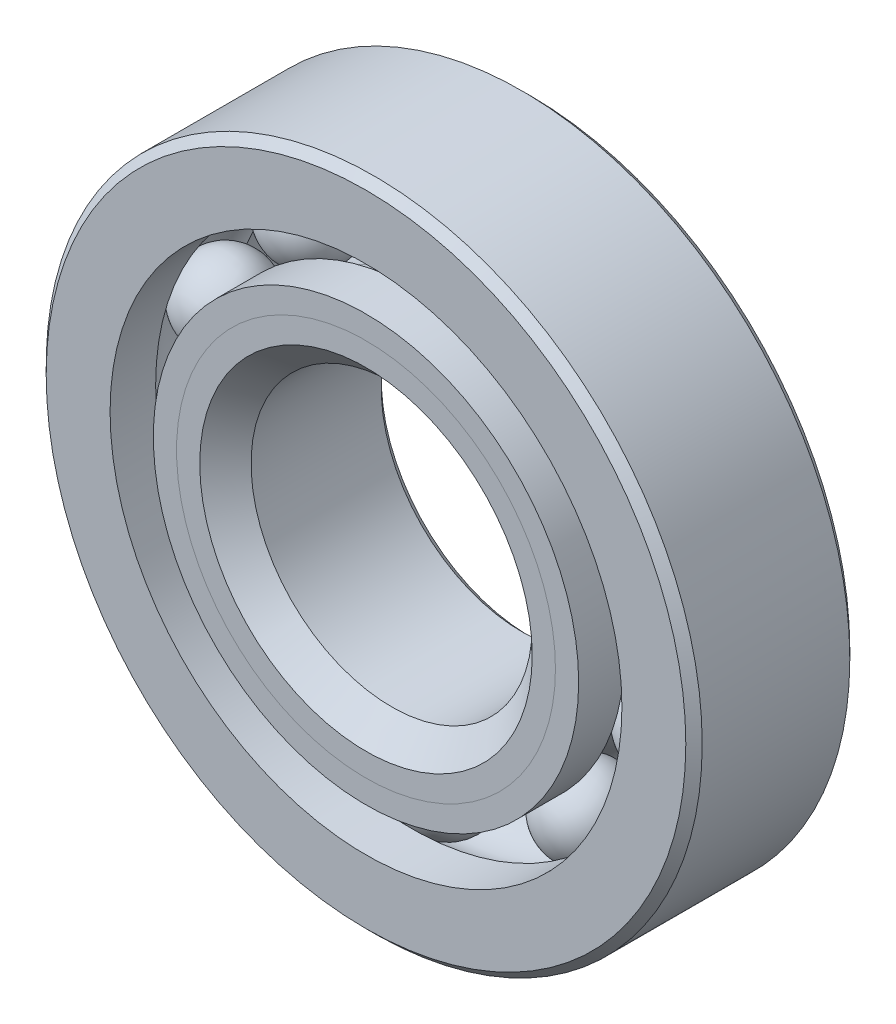
ISO-10303-21;
HEADER;
FILE_DESCRIPTION(('STEP AP214'),'2;1');
FILE_NAME('part.step','',(''),(''),'','','');
FILE_SCHEMA(('AUTOMOTIVE_DESIGN { 1 0 10303 214 1 1 1 1 }'));
ENDSEC;
DATA;
#1=APPLICATION_CONTEXT('core data for automotive mechanical design processes');
#2=APPLICATION_PROTOCOL_DEFINITION('international standard','automotive_design',2000,#1);
#3=PRODUCT_CONTEXT('',#1,'mechanical');
#4=PRODUCT('Part','Part','',(#3));
#5=PRODUCT_RELATED_PRODUCT_CATEGORY('part','',(#4));
#6=PRODUCT_DEFINITION_FORMATION('','',#4);
#7=PRODUCT_DEFINITION_CONTEXT('part definition',#1,'design');
#8=PRODUCT_DEFINITION('design','',#6,#7);
#9=PRODUCT_DEFINITION_SHAPE('','',#8);
#10=(LENGTH_UNIT() NAMED_UNIT(*) SI_UNIT(.MILLI.,.METRE.));
#11=(NAMED_UNIT(*) PLANE_ANGLE_UNIT() SI_UNIT($,.RADIAN.));
#12=(NAMED_UNIT(*) SI_UNIT($,.STERADIAN.) SOLID_ANGLE_UNIT());
#13=UNCERTAINTY_MEASURE_WITH_UNIT(LENGTH_MEASURE(1.E-05),#10,'distance_accuracy_value','');
#14=(GEOMETRIC_REPRESENTATION_CONTEXT(3) GLOBAL_UNCERTAINTY_ASSIGNED_CONTEXT((#13)) GLOBAL_UNIT_ASSIGNED_CONTEXT((#10,
#11,#12)) REPRESENTATION_CONTEXT('',''));
#15=CARTESIAN_POINT('',(0.,0.,0.));
#16=DIRECTION('',(0.,0.,1.));
#17=DIRECTION('',(1.,0.,0.));
#18=AXIS2_PLACEMENT_3D('',#15,#16,#17);
#19=CARTESIAN_POINT('',(-4.66554544007142,6.42157239285121,0.));
#20=DIRECTION('',(0.,0.,1.));
#21=DIRECTION('',(-0.587785252292462,0.809016994374955,0.));
#22=AXIS2_PLACEMENT_3D('',#19,#20,#21);
#23=SPHERICAL_SURFACE('',#22,1.43574962434293);
#24=CARTESIAN_POINT('',(-4.66554544007142,6.42157239285121,1.43574962434293));
#25=VERTEX_POINT('',#24);
#26=VERTEX_LOOP('',#25);
#27=FACE_BOUND('',#26,.T.);
#28=ADVANCED_FACE('F50',(#27),#23,.T.);
#29=CLOSED_SHELL('',(#28));
#30=MANIFOLD_SOLID_BREP('B2',#29);
#31=CARTESIAN_POINT('',(-7.54901109809275,2.45282239285123,0.));
#32=DIRECTION('',(0.,0.,1.));
#33=DIRECTION('',(-0.95105651629515,0.309016994374958,0.));
#34=AXIS2_PLACEMENT_3D('',#31,#32,#33);
#35=SPHERICAL_SURFACE('',#34,1.43574962434293);
#36=CARTESIAN_POINT('',(-7.54901109809275,2.45282239285123,1.43574962434293));
#37=VERTEX_POINT('',#36);
#38=VERTEX_LOOP('',#37);
#39=FACE_BOUND('',#38,.T.);
#40=ADVANCED_FACE('F91',(#39),#35,.T.);
#41=CLOSED_SHELL('',(#40));
#42=MANIFOLD_SOLID_BREP('B6',#41);
#43=CARTESIAN_POINT('',(-7.54901109809281,-2.45282239285107,0.));
#44=DIRECTION('',(0.,0.,1.));
#45=DIRECTION('',(-0.951056516295157,-0.309016994374938,0.));
#46=AXIS2_PLACEMENT_3D('',#43,#44,#45);
#47=SPHERICAL_SURFACE('',#46,1.43574962434293);
#48=CARTESIAN_POINT('',(-7.54901109809281,-2.45282239285107,1.43574962434293));
#49=VERTEX_POINT('',#48);
#50=VERTEX_LOOP('',#49);
#51=FACE_BOUND('',#50,.T.);
#52=ADVANCED_FACE('F130',(#51),#47,.T.);
#53=CLOSED_SHELL('',(#52));
#54=MANIFOLD_SOLID_BREP('B46',#53);
#55=CARTESIAN_POINT('',(-4.66554544007156,-6.4215723928511,0.));
#56=DIRECTION('',(0.,0.,1.));
#57=DIRECTION('',(-0.58778525229248,-0.809016994374942,0.));
#58=AXIS2_PLACEMENT_3D('',#55,#56,#57);
#59=SPHERICAL_SURFACE('',#58,1.43574962434293);
#60=CARTESIAN_POINT('',(-4.66554544007156,-6.4215723928511,1.43574962434293));
#61=VERTEX_POINT('',#60);
#62=VERTEX_LOOP('',#61);
#63=FACE_BOUND('',#62,.T.);
#64=ADVANCED_FACE('F169',(#63),#59,.T.);
#65=CLOSED_SHELL('',(#64));
#66=MANIFOLD_SOLID_BREP('B87',#65);
#67=CARTESIAN_POINT('',(0.,-7.9375,0.));
#68=DIRECTION('',(0.,0.,1.));
#69=DIRECTION('',(0.,-1.,0.));
#70=AXIS2_PLACEMENT_3D('',#67,#68,#69);
#71=SPHERICAL_SURFACE('',#70,1.43574962434293);
#72=CARTESIAN_POINT('',(0.,-7.9375,1.43574962434293));
#73=VERTEX_POINT('',#72);
#74=VERTEX_LOOP('',#73);
#75=FACE_BOUND('',#74,.T.);
#76=ADVANCED_FACE('F208',(#75),#71,.T.);
#77=CLOSED_SHELL('',(#76));
#78=MANIFOLD_SOLID_BREP('B126',#77);
#79=CARTESIAN_POINT('',(4.66554544007147,-6.42157239285117,0.));
#80=DIRECTION('',(0.,0.,1.));
#81=DIRECTION('',(0.587785252292469,-0.809016994374951,0.));
#82=AXIS2_PLACEMENT_3D('',#79,#80,#81);
#83=SPHERICAL_SURFACE('',#82,1.43574962434293);
#84=CARTESIAN_POINT('',(4.66554544007147,-6.42157239285117,1.43574962434293));
#85=VERTEX_POINT('',#84);
#86=VERTEX_LOOP('',#85);
#87=FACE_BOUND('',#86,.T.);
#88=ADVANCED_FACE('F247',(#87),#83,.T.);
#89=CLOSED_SHELL('',(#88));
#90=MANIFOLD_SOLID_BREP('B165',#89);
#91=CARTESIAN_POINT('',(7.54901109809277,-2.45282239285118,0.));
#92=DIRECTION('',(0.,0.,1.));
#93=DIRECTION('',(0.951056516295152,-0.309016994374952,0.));
#94=AXIS2_PLACEMENT_3D('',#91,#92,#93);
#95=SPHERICAL_SURFACE('',#94,1.43574962434293);
#96=CARTESIAN_POINT('',(7.54901109809277,-2.45282239285118,1.43574962434293));
#97=VERTEX_POINT('',#96);
#98=VERTEX_LOOP('',#97);
#99=FACE_BOUND('',#98,.T.);
#100=ADVANCED_FACE('F286',(#99),#95,.T.);
#101=CLOSED_SHELL('',(#100));
#102=MANIFOLD_SOLID_BREP('B204',#101);
#103=CARTESIAN_POINT('',(7.54901109809279,2.45282239285112,0.));
#104=DIRECTION('',(0.,0.,1.));
#105=DIRECTION('',(0.951056516295155,0.309016994374945,0.));
#106=AXIS2_PLACEMENT_3D('',#103,#104,#105);
#107=SPHERICAL_SURFACE('',#106,1.43574962434293);
#108=CARTESIAN_POINT('',(7.54901109809279,2.45282239285112,1.43574962434293));
#109=VERTEX_POINT('',#108);
#110=VERTEX_LOOP('',#109);
#111=FACE_BOUND('',#110,.T.);
#112=ADVANCED_FACE('F325',(#111),#107,.T.);
#113=CLOSED_SHELL('',(#112));
#114=MANIFOLD_SOLID_BREP('B243',#113);
#115=CARTESIAN_POINT('',(4.66554544007152,6.42157239285114,0.));
#116=DIRECTION('',(0.,0.,1.));
#117=DIRECTION('',(0.587785252292474,0.809016994374947,0.));
#118=AXIS2_PLACEMENT_3D('',#115,#116,#117);
#119=SPHERICAL_SURFACE('',#118,1.43574962434293);
#120=CARTESIAN_POINT('',(4.66554544007152,6.42157239285114,1.43574962434293));
#121=VERTEX_POINT('',#120);
#122=VERTEX_LOOP('',#121);
#123=FACE_BOUND('',#122,.T.);
#124=ADVANCED_FACE('F364',(#123),#119,.T.);
#125=CLOSED_SHELL('',(#124));
#126=MANIFOLD_SOLID_BREP('B282',#125);
#127=CARTESIAN_POINT('',(0.,7.9375,0.));
#128=DIRECTION('',(0.,0.,1.));
#129=DIRECTION('',(0.,1.,0.));
#130=AXIS2_PLACEMENT_3D('',#127,#128,#129);
#131=SPHERICAL_SURFACE('',#130,1.43574962434293);
#132=CARTESIAN_POINT('',(0.,7.9375,1.43574962434293));
#133=VERTEX_POINT('',#132);
#134=VERTEX_LOOP('',#133);
#135=FACE_BOUND('',#134,.T.);
#136=ADVANCED_FACE('F407',(#135),#131,.T.);
#137=CLOSED_SHELL('',(#136));
#138=MANIFOLD_SOLID_BREP('B321',#137);
#139=CARTESIAN_POINT('',(0.,6.41846644006812,2.778125));
#140=DIRECTION('',(0.,0.,-1.));
#141=DIRECTION('',(-1.,0.,0.));
#142=AXIS2_PLACEMENT_3D('',#139,#140,#141);
#143=PLANE('',#142);
#144=CARTESIAN_POINT('',(0.,0.,2.778125));
#145=DIRECTION('',(0.,0.,1.));
#146=DIRECTION('',(1.,0.,0.));
#147=AXIS2_PLACEMENT_3D('',#144,#145,#146);
#148=CIRCLE('',#147,5.63212518782854);
#149=CARTESIAN_POINT('',(5.63212518782854,0.,2.778125));
#150=VERTEX_POINT('',#149);
#151=EDGE_CURVE('E473',#150,#150,#148,.T.);
#152=ORIENTED_EDGE('',*,*,#151,.F.);
#153=EDGE_LOOP('',(#152));
#154=FACE_BOUND('',#153,.T.);
#155=CARTESIAN_POINT('',(0.,0.,2.778125));
#156=DIRECTION('',(0.,0.,1.));
#157=DIRECTION('',(1.,0.,0.));
#158=AXIS2_PLACEMENT_3D('',#155,#156,#157);
#159=CIRCLE('',#158,6.41846644006812);
#160=CARTESIAN_POINT('',(6.41846644006812,0.,2.778125));
#161=VERTEX_POINT('',#160);
#162=EDGE_CURVE('E406',#161,#161,#159,.T.);
#163=ORIENTED_EDGE('',*,*,#162,.T.);
#164=EDGE_LOOP('',(#163));
#165=FACE_BOUND('',#164,.T.);
#166=ADVANCED_FACE('F428',(#154,#165),#143,.F.);
#167=CARTESIAN_POINT('',(0.,0.,1.99178374776042));
#168=DIRECTION('',(0.,0.,1.));
#169=DIRECTION('',(1.,0.,0.));
#170=AXIS2_PLACEMENT_3D('',#167,#168,#169);
#171=CONICAL_SURFACE('',#170,5.63212518782854,0.78539816339745);
#172=ORIENTED_EDGE('',*,*,#162,.F.);
#173=EDGE_LOOP('',(#172));
#174=FACE_BOUND('',#173,.T.);
#175=CARTESIAN_POINT('',(0.,0.,1.99178374776042));
#176=DIRECTION('',(0.,0.,1.));
#177=DIRECTION('',(1.,0.,0.));
#178=AXIS2_PLACEMENT_3D('',#175,#176,#177);
#179=CIRCLE('',#178,5.63212518782854);
#180=CARTESIAN_POINT('',(5.63212518782854,0.,1.99178374776042));
#181=VERTEX_POINT('',#180);
#182=EDGE_CURVE('E435',#181,#181,#179,.T.);
#183=ORIENTED_EDGE('',*,*,#182,.T.);
#184=EDGE_LOOP('',(#183));
#185=FACE_BOUND('',#184,.T.);
#186=ADVANCED_FACE('F482',(#174,#185),#171,.T.);
#187=CARTESIAN_POINT('',(0.,0.,2.778125));
#188=DIRECTION('',(0.,0.,1.));
#189=DIRECTION('',(1.,0.,0.));
#190=AXIS2_PLACEMENT_3D('',#187,#188,#189);
#191=CYLINDRICAL_SURFACE('',#190,5.63212518782854);
#192=ORIENTED_EDGE('',*,*,#182,.F.);
#193=EDGE_LOOP('',(#192));
#194=FACE_BOUND('',#193,.T.);
#195=CARTESIAN_POINT('',(0.,0.,0.));
#196=DIRECTION('',(0.,0.,1.));
#197=DIRECTION('',(1.,0.,0.));
#198=AXIS2_PLACEMENT_3D('',#195,#196,#197);
#199=CIRCLE('',#198,5.63212518782854);
#200=CARTESIAN_POINT('',(5.63212518782854,0.,0.));
#201=VERTEX_POINT('',#200);
#202=EDGE_CURVE('E441',#201,#201,#199,.T.);
#203=ORIENTED_EDGE('',*,*,#202,.T.);
#204=EDGE_LOOP('',(#203));
#205=FACE_BOUND('',#204,.T.);
#206=ADVANCED_FACE('F486',(#194,#205),#191,.T.);
#207=CARTESIAN_POINT('',(0.,5.63212518782854,0.));
#208=DIRECTION('',(0.,0.,-1.));
#209=DIRECTION('',(-1.,0.,0.));
#210=AXIS2_PLACEMENT_3D('',#207,#208,#209);
#211=PLANE('',#210);
#212=ORIENTED_EDGE('',*,*,#202,.F.);
#213=EDGE_LOOP('',(#212));
#214=FACE_BOUND('',#213,.T.);
#215=CARTESIAN_POINT('',(0.,0.,0.));
#216=DIRECTION('',(0.,0.,1.));
#217=DIRECTION('',(1.,0.,0.));
#218=AXIS2_PLACEMENT_3D('',#215,#216,#217);
#219=CIRCLE('',#218,6.50175037565707);
#220=CARTESIAN_POINT('',(6.50175037565707,0.,0.));
#221=VERTEX_POINT('',#220);
#222=EDGE_CURVE('E447',#221,#221,#219,.T.);
#223=ORIENTED_EDGE('',*,*,#222,.T.);
#224=EDGE_LOOP('',(#223));
#225=FACE_BOUND('',#224,.T.);
#226=ADVANCED_FACE('F491',(#214,#225),#211,.F.);
#227=CARTESIAN_POINT('',(0.,0.,0.));
#228=DIRECTION('',(0.,0.,1.));
#229=DIRECTION('',(1.,0.,0.));
#230=AXIS2_PLACEMENT_3D('',#227,#228,#229);
#231=TOROIDAL_SURFACE('',#230,7.9375,1.43574962434293);
#232=ORIENTED_EDGE('',*,*,#222,.F.);
#233=EDGE_LOOP('',(#232));
#234=FACE_BOUND('',#233,.T.);
#235=CARTESIAN_POINT('',(0.,0.,-1.23472222222222));
#236=DIRECTION('',(0.,0.,1.));
#237=DIRECTION('',(1.,0.,0.));
#238=AXIS2_PLACEMENT_3D('',#235,#236,#237);
#239=CIRCLE('',#238,7.2048076923077);
#240=CARTESIAN_POINT('',(7.2048076923077,0.,-1.23472222222222));
#241=VERTEX_POINT('',#240);
#242=EDGE_CURVE('E453',#241,#241,#239,.T.);
#243=ORIENTED_EDGE('',*,*,#242,.T.);
#244=EDGE_LOOP('',(#243));
#245=FACE_BOUND('',#244,.T.);
#246=ADVANCED_FACE('F497',(#234,#245),#231,.F.);
#247=CARTESIAN_POINT('',(0.,0.,2.778125));
#248=DIRECTION('',(0.,0.,1.));
#249=DIRECTION('',(1.,0.,0.));
#250=AXIS2_PLACEMENT_3D('',#247,#248,#249);
#251=CYLINDRICAL_SURFACE('',#250,7.2048076923077);
#252=ORIENTED_EDGE('',*,*,#242,.F.);
#253=EDGE_LOOP('',(#252));
#254=FACE_BOUND('',#253,.T.);
#255=CARTESIAN_POINT('',(0.,0.,-2.778125));
#256=DIRECTION('',(0.,0.,1.));
#257=DIRECTION('',(1.,0.,0.));
#258=AXIS2_PLACEMENT_3D('',#255,#256,#257);
#259=CIRCLE('',#258,7.2048076923077);
#260=CARTESIAN_POINT('',(7.2048076923077,0.,-2.778125));
#261=VERTEX_POINT('',#260);
#262=EDGE_CURVE('E457',#261,#261,#259,.T.);
#263=ORIENTED_EDGE('',*,*,#262,.T.);
#264=EDGE_LOOP('',(#263));
#265=FACE_BOUND('',#264,.T.);
#266=ADVANCED_FACE('F501',(#254,#265),#251,.T.);
#267=CARTESIAN_POINT('',(0.,5.0403125,-2.778125));
#268=DIRECTION('',(0.,0.,1.));
#269=DIRECTION('',(1.,0.,0.));
#270=AXIS2_PLACEMENT_3D('',#267,#268,#269);
#271=PLANE('',#270);
#272=ORIENTED_EDGE('',*,*,#262,.F.);
#273=EDGE_LOOP('',(#272));
#274=FACE_BOUND('',#273,.T.);
#275=CARTESIAN_POINT('',(0.,0.,-2.778125));
#276=DIRECTION('',(0.,0.,1.));
#277=DIRECTION('',(1.,0.,0.));
#278=AXIS2_PLACEMENT_3D('',#275,#276,#277);
#279=CIRCLE('',#278,5.0403125);
#280=CARTESIAN_POINT('',(5.0403125,0.,-2.778125));
#281=VERTEX_POINT('',#280);
#282=EDGE_CURVE('E461',#281,#281,#279,.T.);
#283=ORIENTED_EDGE('',*,*,#282,.T.);
#284=EDGE_LOOP('',(#283));
#285=FACE_BOUND('',#284,.T.);
#286=ADVANCED_FACE('F505',(#274,#285),#271,.F.);
#287=CARTESIAN_POINT('',(0.,0.,-2.5003125));
#288=DIRECTION('',(0.,0.,-1.));
#289=DIRECTION('',(-1.,0.,0.));
#290=AXIS2_PLACEMENT_3D('',#287,#288,#289);
#291=CONICAL_SURFACE('',#290,4.7625,0.785398163397447);
#292=ORIENTED_EDGE('',*,*,#282,.F.);
#293=EDGE_LOOP('',(#292));
#294=FACE_BOUND('',#293,.T.);
#295=CARTESIAN_POINT('',(0.,0.,-2.5003125));
#296=DIRECTION('',(0.,0.,1.));
#297=DIRECTION('',(1.,0.,0.));
#298=AXIS2_PLACEMENT_3D('',#295,#296,#297);
#299=CIRCLE('',#298,4.7625);
#300=CARTESIAN_POINT('',(4.7625,0.,-2.5003125));
#301=VERTEX_POINT('',#300);
#302=EDGE_CURVE('E465',#301,#301,#299,.T.);
#303=ORIENTED_EDGE('',*,*,#302,.T.);
#304=EDGE_LOOP('',(#303));
#305=FACE_BOUND('',#304,.T.);
#306=ADVANCED_FACE('F509',(#294,#305),#291,.F.);
#307=CARTESIAN_POINT('',(0.,0.,2.778125));
#308=DIRECTION('',(0.,0.,1.));
#309=DIRECTION('',(1.,0.,0.));
#310=AXIS2_PLACEMENT_3D('',#307,#308,#309);
#311=CYLINDRICAL_SURFACE('',#310,4.7625);
#312=ORIENTED_EDGE('',*,*,#302,.F.);
#313=EDGE_LOOP('',(#312));
#314=FACE_BOUND('',#313,.T.);
#315=CARTESIAN_POINT('',(0.,0.,1.90849981217147));
#316=DIRECTION('',(0.,0.,1.));
#317=DIRECTION('',(1.,0.,0.));
#318=AXIS2_PLACEMENT_3D('',#315,#316,#317);
#319=CIRCLE('',#318,4.7625);
#320=CARTESIAN_POINT('',(4.7625,0.,1.90849981217147));
#321=VERTEX_POINT('',#320);
#322=EDGE_CURVE('E469',#321,#321,#319,.T.);
#323=ORIENTED_EDGE('',*,*,#322,.T.);
#324=EDGE_LOOP('',(#323));
#325=FACE_BOUND('',#324,.T.);
#326=ADVANCED_FACE('F513',(#314,#325),#311,.F.);
#327=CARTESIAN_POINT('',(0.,0.,2.778125));
#328=DIRECTION('',(0.,0.,1.));
#329=DIRECTION('',(1.,0.,0.));
#330=AXIS2_PLACEMENT_3D('',#327,#328,#329);
#331=CONICAL_SURFACE('',#330,5.63212518782854,0.78539816339745);
#332=ORIENTED_EDGE('',*,*,#322,.F.);
#333=EDGE_LOOP('',(#332));
#334=FACE_BOUND('',#333,.T.);
#335=ORIENTED_EDGE('',*,*,#151,.T.);
#336=EDGE_LOOP('',(#335));
#337=FACE_BOUND('',#336,.T.);
#338=ADVANCED_FACE('F479',(#334,#337),#331,.F.);
#339=CLOSED_SHELL('',(#166,#186,#206,#226,#246,#266,#286,#306,#326,#338));
#340=MANIFOLD_SOLID_BREP('B360',#339);
#341=CARTESIAN_POINT('',(0.,7.2048076923077,2.778125));
#342=DIRECTION('',(0.,0.,-1.));
#343=DIRECTION('',(-1.,0.,0.));
#344=AXIS2_PLACEMENT_3D('',#341,#342,#343);
#345=PLANE('',#344);
#346=CARTESIAN_POINT('',(0.,0.,2.778125));
#347=DIRECTION('',(0.,0.,1.));
#348=DIRECTION('',(1.,0.,0.));
#349=AXIS2_PLACEMENT_3D('',#346,#347,#348);
#350=CIRCLE('',#349,6.41846644006812);
#351=CARTESIAN_POINT('',(6.41846644006812,0.,2.778125));
#352=VERTEX_POINT('',#351);
#353=EDGE_CURVE('E427',#352,#352,#350,.T.);
#354=ORIENTED_EDGE('',*,*,#353,.F.);
#355=EDGE_LOOP('',(#354));
#356=FACE_BOUND('',#355,.T.);
#357=CARTESIAN_POINT('',(0.,0.,2.778125));
#358=DIRECTION('',(0.,0.,1.));
#359=DIRECTION('',(1.,0.,0.));
#360=AXIS2_PLACEMENT_3D('',#357,#358,#359);
#361=CIRCLE('',#360,7.2048076923077);
#362=CARTESIAN_POINT('',(7.2048076923077,0.,2.778125));
#363=VERTEX_POINT('',#362);
#364=EDGE_CURVE('E636',#363,#363,#361,.T.);
#365=ORIENTED_EDGE('',*,*,#364,.T.);
#366=EDGE_LOOP('',(#365));
#367=FACE_BOUND('',#366,.T.);
#368=ADVANCED_FACE('F607',(#356,#367),#345,.F.);
#369=CARTESIAN_POINT('',(0.,0.,2.778125));
#370=DIRECTION('',(0.,0.,1.));
#371=DIRECTION('',(1.,0.,0.));
#372=AXIS2_PLACEMENT_3D('',#369,#370,#371);
#373=CONICAL_SURFACE('',#372,6.41846644006812,0.78539816339745);
#374=CARTESIAN_POINT('',(0.,0.,1.99178374776042));
#375=DIRECTION('',(0.,0.,1.));
#376=DIRECTION('',(1.,0.,0.));
#377=AXIS2_PLACEMENT_3D('',#374,#375,#376);
#378=CIRCLE('',#377,5.63212518782854);
#379=CARTESIAN_POINT('',(5.63212518782854,0.,1.99178374776042));
#380=VERTEX_POINT('',#379);
#381=EDGE_CURVE('E614',#380,#380,#378,.T.);
#382=ORIENTED_EDGE('',*,*,#381,.F.);
#383=EDGE_LOOP('',(#382));
#384=FACE_BOUND('',#383,.T.);
#385=ORIENTED_EDGE('',*,*,#353,.T.);
#386=EDGE_LOOP('',(#385));
#387=FACE_BOUND('',#386,.T.);
#388=ADVANCED_FACE('F663',(#384,#387),#373,.F.);
#389=CARTESIAN_POINT('',(0.,0.,2.778125));
#390=DIRECTION('',(0.,0.,1.));
#391=DIRECTION('',(1.,0.,0.));
#392=AXIS2_PLACEMENT_3D('',#389,#390,#391);
#393=CYLINDRICAL_SURFACE('',#392,5.63212518782854);
#394=CARTESIAN_POINT('',(0.,0.,0.));
#395=DIRECTION('',(0.,0.,1.));
#396=DIRECTION('',(1.,0.,0.));
#397=AXIS2_PLACEMENT_3D('',#394,#395,#396);
#398=CIRCLE('',#397,5.63212518782854);
#399=CARTESIAN_POINT('',(5.63212518782854,0.,0.));
#400=VERTEX_POINT('',#399);
#401=EDGE_CURVE('E620',#400,#400,#398,.T.);
#402=ORIENTED_EDGE('',*,*,#401,.F.);
#403=EDGE_LOOP('',(#402));
#404=FACE_BOUND('',#403,.T.);
#405=ORIENTED_EDGE('',*,*,#381,.T.);
#406=EDGE_LOOP('',(#405));
#407=FACE_BOUND('',#406,.T.);
#408=ADVANCED_FACE('F658',(#404,#407),#393,.F.);
#409=CARTESIAN_POINT('',(0.,5.63212518782854,0.));
#410=DIRECTION('',(0.,0.,1.));
#411=DIRECTION('',(1.,0.,0.));
#412=AXIS2_PLACEMENT_3D('',#409,#410,#411);
#413=PLANE('',#412);
#414=CARTESIAN_POINT('',(0.,0.,0.));
#415=DIRECTION('',(0.,0.,1.));
#416=DIRECTION('',(1.,0.,0.));
#417=AXIS2_PLACEMENT_3D('',#414,#415,#416);
#418=CIRCLE('',#417,6.50175037565707);
#419=CARTESIAN_POINT('',(6.50175037565707,0.,0.));
#420=VERTEX_POINT('',#419);
#421=EDGE_CURVE('E626',#420,#420,#418,.T.);
#422=ORIENTED_EDGE('',*,*,#421,.F.);
#423=EDGE_LOOP('',(#422));
#424=FACE_BOUND('',#423,.T.);
#425=ORIENTED_EDGE('',*,*,#401,.T.);
#426=EDGE_LOOP('',(#425));
#427=FACE_BOUND('',#426,.T.);
#428=ADVANCED_FACE('F652',(#424,#427),#413,.F.);
#429=CARTESIAN_POINT('',(0.,0.,0.));
#430=DIRECTION('',(0.,0.,1.));
#431=DIRECTION('',(1.,0.,0.));
#432=AXIS2_PLACEMENT_3D('',#429,#430,#431);
#433=TOROIDAL_SURFACE('',#432,7.9375,1.43574962434293);
#434=CARTESIAN_POINT('',(0.,0.,1.23472222222222));
#435=DIRECTION('',(0.,0.,1.));
#436=DIRECTION('',(1.,0.,0.));
#437=AXIS2_PLACEMENT_3D('',#434,#435,#436);
#438=CIRCLE('',#437,7.2048076923077);
#439=CARTESIAN_POINT('',(7.2048076923077,0.,1.23472222222222));
#440=VERTEX_POINT('',#439);
#441=EDGE_CURVE('E632',#440,#440,#438,.T.);
#442=ORIENTED_EDGE('',*,*,#441,.F.);
#443=EDGE_LOOP('',(#442));
#444=FACE_BOUND('',#443,.T.);
#445=ORIENTED_EDGE('',*,*,#421,.T.);
#446=EDGE_LOOP('',(#445));
#447=FACE_BOUND('',#446,.T.);
#448=ADVANCED_FACE('F646',(#444,#447),#433,.F.);
#449=CARTESIAN_POINT('',(0.,0.,2.778125));
#450=DIRECTION('',(0.,0.,1.));
#451=DIRECTION('',(1.,0.,0.));
#452=AXIS2_PLACEMENT_3D('',#449,#450,#451);
#453=CYLINDRICAL_SURFACE('',#452,7.2048076923077);
#454=ORIENTED_EDGE('',*,*,#364,.F.);
#455=EDGE_LOOP('',(#454));
#456=FACE_BOUND('',#455,.T.);
#457=ORIENTED_EDGE('',*,*,#441,.T.);
#458=EDGE_LOOP('',(#457));
#459=FACE_BOUND('',#458,.T.);
#460=ADVANCED_FACE('F643',(#456,#459),#453,.T.);
#461=CLOSED_SHELL('',(#368,#388,#408,#428,#448,#460));
#462=MANIFOLD_SOLID_BREP('B401',#461);
#463=CARTESIAN_POINT('',(0.,0.,2.5003125));
#464=DIRECTION('',(0.,0.,-1.));
#465=DIRECTION('',(-1.,0.,0.));
#466=AXIS2_PLACEMENT_3D('',#463,#464,#465);
#467=CONICAL_SURFACE('',#466,11.1125,0.785398163397446);
#468=CARTESIAN_POINT('',(0.,0.,2.778125));
#469=DIRECTION('',(0.,0.,1.));
#470=DIRECTION('',(1.,0.,0.));
#471=AXIS2_PLACEMENT_3D('',#468,#469,#470);
#472=CIRCLE('',#471,10.8346875);
#473=CARTESIAN_POINT('',(10.8346875,0.,2.778125));
#474=VERTEX_POINT('',#473);
#475=EDGE_CURVE('E748',#474,#474,#472,.T.);
#476=ORIENTED_EDGE('',*,*,#475,.F.);
#477=EDGE_LOOP('',(#476));
#478=FACE_BOUND('',#477,.T.);
#479=CARTESIAN_POINT('',(0.,0.,2.5003125));
#480=DIRECTION('',(0.,0.,1.));
#481=DIRECTION('',(1.,0.,0.));
#482=AXIS2_PLACEMENT_3D('',#479,#480,#481);
#483=CIRCLE('',#482,11.1125);
#484=CARTESIAN_POINT('',(11.1125,0.,2.5003125));
#485=VERTEX_POINT('',#484);
#486=EDGE_CURVE('E606',#485,#485,#483,.T.);
#487=ORIENTED_EDGE('',*,*,#486,.T.);
#488=EDGE_LOOP('',(#487));
#489=FACE_BOUND('',#488,.T.);
#490=ADVANCED_FACE('F711',(#478,#489),#467,.T.);
#491=CARTESIAN_POINT('',(0.,0.,2.778125));
#492=DIRECTION('',(0.,0.,1.));
#493=DIRECTION('',(1.,0.,0.));
#494=AXIS2_PLACEMENT_3D('',#491,#492,#493);
#495=CYLINDRICAL_SURFACE('',#494,11.1125);
#496=ORIENTED_EDGE('',*,*,#486,.F.);
#497=EDGE_LOOP('',(#496));
#498=FACE_BOUND('',#497,.T.);
#499=CARTESIAN_POINT('',(0.,0.,-2.5003125));
#500=DIRECTION('',(0.,0.,1.));
#501=DIRECTION('',(1.,0.,0.));
#502=AXIS2_PLACEMENT_3D('',#499,#500,#501);
#503=CIRCLE('',#502,11.1125);
#504=CARTESIAN_POINT('',(11.1125,0.,-2.5003125));
#505=VERTEX_POINT('',#504);
#506=EDGE_CURVE('E718',#505,#505,#503,.T.);
#507=ORIENTED_EDGE('',*,*,#506,.T.);
#508=EDGE_LOOP('',(#507));
#509=FACE_BOUND('',#508,.T.);
#510=ADVANCED_FACE('F757',(#498,#509),#495,.T.);
#511=CARTESIAN_POINT('',(0.,0.,-2.778125));
#512=DIRECTION('',(0.,0.,1.));
#513=DIRECTION('',(1.,0.,0.));
#514=AXIS2_PLACEMENT_3D('',#511,#512,#513);
#515=CONICAL_SURFACE('',#514,10.8346875,0.785398163397447);
#516=ORIENTED_EDGE('',*,*,#506,.F.);
#517=EDGE_LOOP('',(#516));
#518=FACE_BOUND('',#517,.T.);
#519=CARTESIAN_POINT('',(0.,0.,-2.778125));
#520=DIRECTION('',(0.,0.,1.));
#521=DIRECTION('',(1.,0.,0.));
#522=AXIS2_PLACEMENT_3D('',#519,#520,#521);
#523=CIRCLE('',#522,10.8346875);
#524=CARTESIAN_POINT('',(10.8346875,0.,-2.778125));
#525=VERTEX_POINT('',#524);
#526=EDGE_CURVE('E724',#525,#525,#523,.T.);
#527=ORIENTED_EDGE('',*,*,#526,.T.);
#528=EDGE_LOOP('',(#527));
#529=FACE_BOUND('',#528,.T.);
#530=ADVANCED_FACE('F761',(#518,#529),#515,.T.);
#531=CARTESIAN_POINT('',(0.,10.8346875,-2.778125));
#532=DIRECTION('',(0.,0.,1.));
#533=DIRECTION('',(1.,0.,0.));
#534=AXIS2_PLACEMENT_3D('',#531,#532,#533);
#535=PLANE('',#534);
#536=ORIENTED_EDGE('',*,*,#526,.F.);
#537=EDGE_LOOP('',(#536));
#538=FACE_BOUND('',#537,.T.);
#539=CARTESIAN_POINT('',(0.,0.,-2.778125));
#540=DIRECTION('',(0.,0.,1.));
#541=DIRECTION('',(1.,0.,0.));
#542=AXIS2_PLACEMENT_3D('',#539,#540,#541);
#543=CIRCLE('',#542,8.67019230769231);
#544=CARTESIAN_POINT('',(8.67019230769231,0.,-2.778125));
#545=VERTEX_POINT('',#544);
#546=EDGE_CURVE('E730',#545,#545,#543,.T.);
#547=ORIENTED_EDGE('',*,*,#546,.T.);
#548=EDGE_LOOP('',(#547));
#549=FACE_BOUND('',#548,.T.);
#550=ADVANCED_FACE('F766',(#538,#549),#535,.F.);
#551=CARTESIAN_POINT('',(0.,0.,2.778125));
#552=DIRECTION('',(0.,0.,1.));
#553=DIRECTION('',(1.,0.,0.));
#554=AXIS2_PLACEMENT_3D('',#551,#552,#553);
#555=CYLINDRICAL_SURFACE('',#554,8.67019230769231);
#556=ORIENTED_EDGE('',*,*,#546,.F.);
#557=EDGE_LOOP('',(#556));
#558=FACE_BOUND('',#557,.T.);
#559=CARTESIAN_POINT('',(0.,0.,-1.23472222222222));
#560=DIRECTION('',(0.,0.,1.));
#561=DIRECTION('',(1.,0.,0.));
#562=AXIS2_PLACEMENT_3D('',#559,#560,#561);
#563=CIRCLE('',#562,8.67019230769231);
#564=CARTESIAN_POINT('',(8.67019230769231,0.,-1.23472222222222));
#565=VERTEX_POINT('',#564);
#566=EDGE_CURVE('E736',#565,#565,#563,.T.);
#567=ORIENTED_EDGE('',*,*,#566,.T.);
#568=EDGE_LOOP('',(#567));
#569=FACE_BOUND('',#568,.T.);
#570=ADVANCED_FACE('F772',(#558,#569),#555,.F.);
#571=CARTESIAN_POINT('',(0.,0.,0.));
#572=DIRECTION('',(0.,0.,1.));
#573=DIRECTION('',(1.,0.,0.));
#574=AXIS2_PLACEMENT_3D('',#571,#572,#573);
#575=TOROIDAL_SURFACE('',#574,7.9375,1.43574962434293);
#576=ORIENTED_EDGE('',*,*,#566,.F.);
#577=EDGE_LOOP('',(#576));
#578=FACE_BOUND('',#577,.T.);
#579=CARTESIAN_POINT('',(0.,0.,1.23472222222222));
#580=DIRECTION('',(0.,0.,1.));
#581=DIRECTION('',(1.,0.,0.));
#582=AXIS2_PLACEMENT_3D('',#579,#580,#581);
#583=CIRCLE('',#582,8.67019230769231);
#584=CARTESIAN_POINT('',(8.67019230769231,0.,1.23472222222222));
#585=VERTEX_POINT('',#584);
#586=EDGE_CURVE('E740',#585,#585,#583,.T.);
#587=ORIENTED_EDGE('',*,*,#586,.T.);
#588=EDGE_LOOP('',(#587));
#589=FACE_BOUND('',#588,.T.);
#590=ADVANCED_FACE('F776',(#578,#589),#575,.F.);
#591=CARTESIAN_POINT('',(0.,0.,2.778125));
#592=DIRECTION('',(0.,0.,1.));
#593=DIRECTION('',(1.,0.,0.));
#594=AXIS2_PLACEMENT_3D('',#591,#592,#593);
#595=CYLINDRICAL_SURFACE('',#594,8.67019230769231);
#596=ORIENTED_EDGE('',*,*,#586,.F.);
#597=EDGE_LOOP('',(#596));
#598=FACE_BOUND('',#597,.T.);
#599=CARTESIAN_POINT('',(0.,0.,2.778125));
#600=DIRECTION('',(0.,0.,1.));
#601=DIRECTION('',(1.,0.,0.));
#602=AXIS2_PLACEMENT_3D('',#599,#600,#601);
#603=CIRCLE('',#602,8.67019230769231);
#604=CARTESIAN_POINT('',(8.67019230769231,0.,2.778125));
#605=VERTEX_POINT('',#604);
#606=EDGE_CURVE('E744',#605,#605,#603,.T.);
#607=ORIENTED_EDGE('',*,*,#606,.T.);
#608=EDGE_LOOP('',(#607));
#609=FACE_BOUND('',#608,.T.);
#610=ADVANCED_FACE('F780',(#598,#609),#595,.F.);
#611=CARTESIAN_POINT('',(0.,10.8346875,2.778125));
#612=DIRECTION('',(0.,0.,-1.));
#613=DIRECTION('',(-1.,0.,0.));
#614=AXIS2_PLACEMENT_3D('',#611,#612,#613);
#615=PLANE('',#614);
#616=ORIENTED_EDGE('',*,*,#606,.F.);
#617=EDGE_LOOP('',(#616));
#618=FACE_BOUND('',#617,.T.);
#619=ORIENTED_EDGE('',*,*,#475,.T.);
#620=EDGE_LOOP('',(#619));
#621=FACE_BOUND('',#620,.T.);
#622=ADVANCED_FACE('F754',(#618,#621),#615,.F.);
#623=CLOSED_SHELL('',(#490,#510,#530,#550,#570,#590,#610,#622));
#624=MANIFOLD_SOLID_BREP('B422',#623);
#625=ADVANCED_BREP_SHAPE_REPRESENTATION('',(#18,#30,#42,#54,#66,#78,#90,#102,#114,#126,#138,
#340,#462,#624),#14);
#626=SHAPE_DEFINITION_REPRESENTATION(#9,#625);
ENDSEC;
END-ISO-10303-21;
